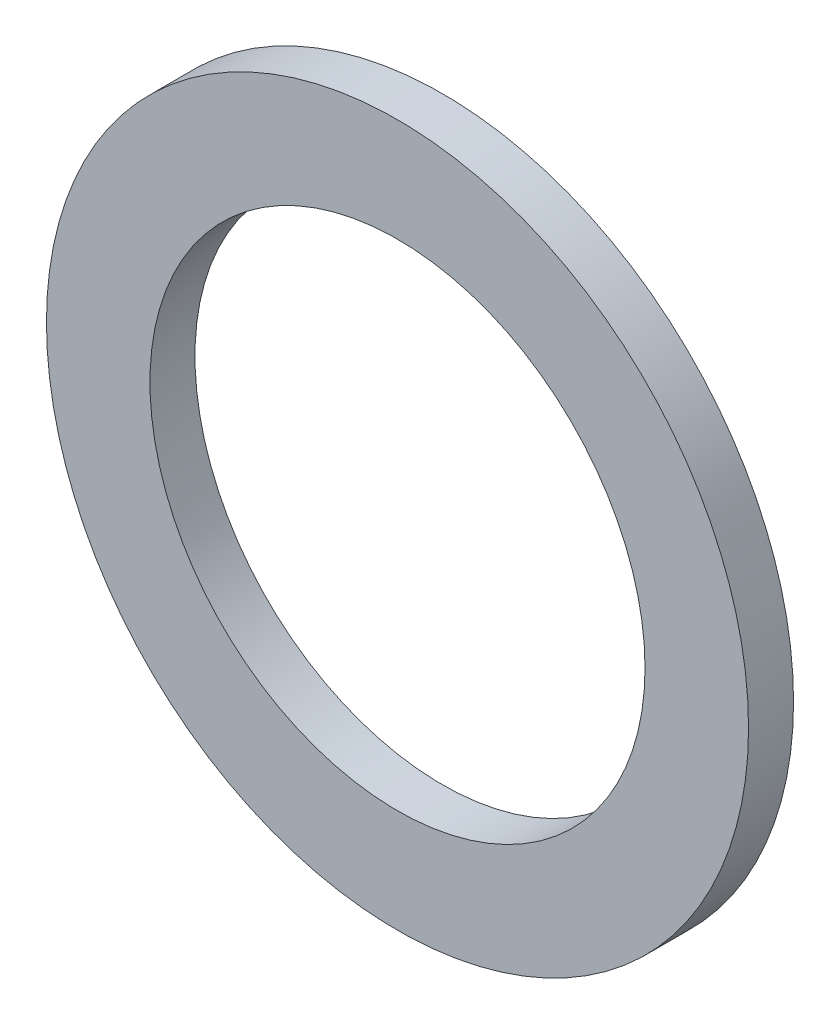
ISO-10303-21;
HEADER;
FILE_DESCRIPTION(('STEP AP214'),'2;1');
FILE_NAME('part.step','',(''),(''),'','','');
FILE_SCHEMA(('AUTOMOTIVE_DESIGN { 1 0 10303 214 1 1 1 1 }'));
ENDSEC;
DATA;
#1=APPLICATION_CONTEXT('core data for automotive mechanical design processes');
#2=APPLICATION_PROTOCOL_DEFINITION('international standard','automotive_design',2000,#1);
#3=PRODUCT_CONTEXT('',#1,'mechanical');
#4=PRODUCT('Part','Part','',(#3));
#5=PRODUCT_RELATED_PRODUCT_CATEGORY('part','',(#4));
#6=PRODUCT_DEFINITION_FORMATION('','',#4);
#7=PRODUCT_DEFINITION_CONTEXT('part definition',#1,'design');
#8=PRODUCT_DEFINITION('design','',#6,#7);
#9=PRODUCT_DEFINITION_SHAPE('','',#8);
#10=(LENGTH_UNIT() NAMED_UNIT(*) SI_UNIT(.MILLI.,.METRE.));
#11=(NAMED_UNIT(*) PLANE_ANGLE_UNIT() SI_UNIT($,.RADIAN.));
#12=(NAMED_UNIT(*) SI_UNIT($,.STERADIAN.) SOLID_ANGLE_UNIT());
#13=UNCERTAINTY_MEASURE_WITH_UNIT(LENGTH_MEASURE(1.E-05),#10,'distance_accuracy_value','');
#14=(GEOMETRIC_REPRESENTATION_CONTEXT(3) GLOBAL_UNCERTAINTY_ASSIGNED_CONTEXT((#13)) GLOBAL_UNIT_ASSIGNED_CONTEXT((#10,
#11,#12)) REPRESENTATION_CONTEXT('',''));
#15=CARTESIAN_POINT('',(0.,0.,0.));
#16=DIRECTION('',(0.,0.,1.));
#17=DIRECTION('',(1.,0.,0.));
#18=AXIS2_PLACEMENT_3D('',#15,#16,#17);
#19=CARTESIAN_POINT('',(0.,0.,5.));
#20=DIRECTION('',(0.,0.,1.));
#21=DIRECTION('',(1.,0.,0.));
#22=AXIS2_PLACEMENT_3D('',#19,#20,#21);
#23=PLANE('',#22);
#24=CARTESIAN_POINT('',(0.,0.,5.));
#25=DIRECTION('',(0.,0.,1.));
#26=DIRECTION('',(1.,0.,0.));
#27=AXIS2_PLACEMENT_3D('',#24,#25,#26);
#28=CIRCLE('',#27,39.);
#29=CARTESIAN_POINT('',(39.,0.,5.));
#30=VERTEX_POINT('',#29);
#31=EDGE_CURVE('E10',#30,#30,#28,.T.);
#32=ORIENTED_EDGE('',*,*,#31,.T.);
#33=EDGE_LOOP('',(#32));
#34=FACE_BOUND('',#33,.T.);
#35=CARTESIAN_POINT('',(0.,0.,5.));
#36=DIRECTION('',(0.,0.,1.));
#37=DIRECTION('',(1.,0.,0.));
#38=AXIS2_PLACEMENT_3D('',#35,#36,#37);
#39=CIRCLE('',#38,27.5);
#40=CARTESIAN_POINT('',(27.5,0.,5.));
#41=VERTEX_POINT('',#40);
#42=EDGE_CURVE('E50',#41,#41,#39,.T.);
#43=ORIENTED_EDGE('',*,*,#42,.F.);
#44=EDGE_LOOP('',(#43));
#45=FACE_BOUND('',#44,.T.);
#46=ADVANCED_FACE('F37',(#34,#45),#23,.T.);
#47=CARTESIAN_POINT('',(0.,0.,0.));
#48=DIRECTION('',(0.,0.,1.));
#49=DIRECTION('',(1.,0.,0.));
#50=AXIS2_PLACEMENT_3D('',#47,#48,#49);
#51=PLANE('',#50);
#52=CARTESIAN_POINT('',(0.,0.,0.));
#53=DIRECTION('',(0.,0.,1.));
#54=DIRECTION('',(1.,0.,0.));
#55=AXIS2_PLACEMENT_3D('',#52,#53,#54);
#56=CIRCLE('',#55,39.);
#57=CARTESIAN_POINT('',(39.,0.,0.));
#58=VERTEX_POINT('',#57);
#59=EDGE_CURVE('E41',#58,#58,#56,.T.);
#60=ORIENTED_EDGE('',*,*,#59,.F.);
#61=EDGE_LOOP('',(#60));
#62=FACE_BOUND('',#61,.T.);
#63=CARTESIAN_POINT('',(0.,0.,0.));
#64=DIRECTION('',(0.,0.,1.));
#65=DIRECTION('',(1.,0.,0.));
#66=AXIS2_PLACEMENT_3D('',#63,#64,#65);
#67=CIRCLE('',#66,27.5);
#68=CARTESIAN_POINT('',(27.5,0.,0.));
#69=VERTEX_POINT('',#68);
#70=EDGE_CURVE('E52',#69,#69,#67,.T.);
#71=ORIENTED_EDGE('',*,*,#70,.T.);
#72=EDGE_LOOP('',(#71));
#73=FACE_BOUND('',#72,.T.);
#74=ADVANCED_FACE('F64',(#62,#73),#51,.F.);
#75=CARTESIAN_POINT('',(0.,0.,5.));
#76=DIRECTION('',(0.,0.,-1.));
#77=DIRECTION('',(-1.,0.,0.));
#78=AXIS2_PLACEMENT_3D('',#75,#76,#77);
#79=CYLINDRICAL_SURFACE('',#78,39.);
#80=ORIENTED_EDGE('',*,*,#31,.F.);
#81=EDGE_LOOP('',(#80));
#82=FACE_BOUND('',#81,.T.);
#83=ORIENTED_EDGE('',*,*,#59,.T.);
#84=EDGE_LOOP('',(#83));
#85=FACE_BOUND('',#84,.T.);
#86=ADVANCED_FACE('F39',(#82,#85),#79,.T.);
#87=CARTESIAN_POINT('',(0.,0.,5.));
#88=DIRECTION('',(0.,0.,-1.));
#89=DIRECTION('',(-1.,0.,0.));
#90=AXIS2_PLACEMENT_3D('',#87,#88,#89);
#91=CYLINDRICAL_SURFACE('',#90,27.5);
#92=ORIENTED_EDGE('',*,*,#42,.T.);
#93=EDGE_LOOP('',(#92));
#94=FACE_BOUND('',#93,.T.);
#95=ORIENTED_EDGE('',*,*,#70,.F.);
#96=EDGE_LOOP('',(#95));
#97=FACE_BOUND('',#96,.T.);
#98=ADVANCED_FACE('F60',(#94,#97),#91,.F.);
#99=CLOSED_SHELL('',(#46,#74,#86,#98));
#100=MANIFOLD_SOLID_BREP('B2',#99);
#101=ADVANCED_BREP_SHAPE_REPRESENTATION('',(#18,#100),#14);
#102=SHAPE_DEFINITION_REPRESENTATION(#9,#101);
ENDSEC;
END-ISO-10303-21;
